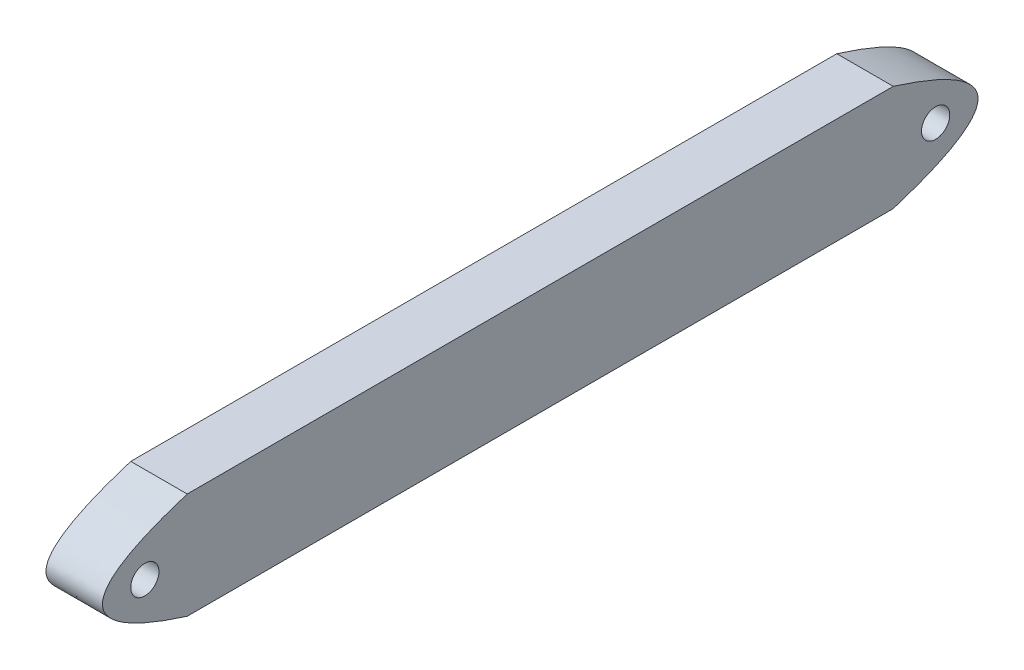
ISO-10303-21;
HEADER;
FILE_DESCRIPTION(('STEP AP214'),'2;1');
FILE_NAME('part.step','',(''),(''),'','','');
FILE_SCHEMA(('AUTOMOTIVE_DESIGN { 1 0 10303 214 1 1 1 1 }'));
ENDSEC;
DATA;
#1=APPLICATION_CONTEXT('core data for automotive mechanical design processes');
#2=APPLICATION_PROTOCOL_DEFINITION('international standard','automotive_design',2000,#1);
#3=PRODUCT_CONTEXT('',#1,'mechanical');
#4=PRODUCT('Part','Part','',(#3));
#5=PRODUCT_RELATED_PRODUCT_CATEGORY('part','',(#4));
#6=PRODUCT_DEFINITION_FORMATION('','',#4);
#7=PRODUCT_DEFINITION_CONTEXT('part definition',#1,'design');
#8=PRODUCT_DEFINITION('design','',#6,#7);
#9=PRODUCT_DEFINITION_SHAPE('','',#8);
#10=(LENGTH_UNIT() NAMED_UNIT(*) SI_UNIT(.MILLI.,.METRE.));
#11=(NAMED_UNIT(*) PLANE_ANGLE_UNIT() SI_UNIT($,.RADIAN.));
#12=(NAMED_UNIT(*) SI_UNIT($,.STERADIAN.) SOLID_ANGLE_UNIT());
#13=UNCERTAINTY_MEASURE_WITH_UNIT(LENGTH_MEASURE(1.E-05),#10,'distance_accuracy_value','');
#14=(GEOMETRIC_REPRESENTATION_CONTEXT(3) GLOBAL_UNCERTAINTY_ASSIGNED_CONTEXT((#13)) GLOBAL_UNIT_ASSIGNED_CONTEXT((#10,
#11,#12)) REPRESENTATION_CONTEXT('',''));
#15=CARTESIAN_POINT('',(0.,0.,0.));
#16=DIRECTION('',(0.,0.,1.));
#17=DIRECTION('',(1.,0.,0.));
#18=AXIS2_PLACEMENT_3D('',#15,#16,#17);
#19=CARTESIAN_POINT('',(8.,-16.0017256081142,-50.1483584502271));
#20=DIRECTION('',(-1.,0.,0.));
#21=DIRECTION('',(0.,0.,1.));
#22=AXIS2_PLACEMENT_3D('',#19,#20,#21);
#23=PLANE('',#22);
#24=CARTESIAN_POINT('',(8.,-8.50172560811416,-62.1483584502271));
#25=CARTESIAN_POINT('',(8.,-16.0017256081142,-38.1483584502271));
#26=CARTESIAN_POINT('',(8.,-23.5017256081142,-62.1483584502271));
#27=B_SPLINE_CURVE_WITH_KNOTS('',2,(#24,#25,#26),.UNSPECIFIED.,.F.,.F.,(3,3),(0.,1.),.UNSPECIFIED.);
#28=CARTESIAN_POINT('',(8.,-8.50172560811416,-62.1483584502271));
#29=VERTEX_POINT('',#28);
#30=CARTESIAN_POINT('',(8.,-23.5017256081142,-62.1483584502271));
#31=VERTEX_POINT('',#30);
#32=EDGE_CURVE('E93',#29,#31,#27,.T.);
#33=ORIENTED_EDGE('',*,*,#32,.T.);
#34=DIRECTION('',(0.,0.,-1.));
#35=VECTOR('',#34,1.);
#36=CARTESIAN_POINT('',(8.,-23.5017256081142,-62.1483584502271));
#37=LINE('',#36,#35);
#38=CARTESIAN_POINT('',(8.,-23.5017256081142,-162.148358450227));
#39=VERTEX_POINT('',#38);
#40=EDGE_CURVE('E88',#31,#39,#37,.T.);
#41=ORIENTED_EDGE('',*,*,#40,.T.);
#42=CARTESIAN_POINT('',(8.,-23.5017256081142,-162.148358450227));
#43=CARTESIAN_POINT('',(8.,-16.0017256081142,-186.148358450227));
#44=CARTESIAN_POINT('',(8.,-8.50172560811416,-162.148358450227));
#45=B_SPLINE_CURVE_WITH_KNOTS('',2,(#42,#43,#44),.UNSPECIFIED.,.F.,.F.,(3,3),(0.,1.),.UNSPECIFIED.);
#46=CARTESIAN_POINT('',(8.,-8.50172560811416,-162.148358450227));
#47=VERTEX_POINT('',#46);
#48=EDGE_CURVE('E91',#39,#47,#45,.T.);
#49=ORIENTED_EDGE('',*,*,#48,.T.);
#50=DIRECTION('',(0.,0.,1.));
#51=VECTOR('',#50,1.);
#52=CARTESIAN_POINT('',(8.,-8.50172560811416,-62.1483584502271));
#53=LINE('',#52,#51);
#54=EDGE_CURVE('E58',#47,#29,#53,.T.);
#55=ORIENTED_EDGE('',*,*,#54,.T.);
#56=EDGE_LOOP('',(#33,#41,#49,#55));
#57=FACE_BOUND('',#56,.T.);
#58=CARTESIAN_POINT('',(8.,-16.0017256081142,-56.148358450227));
#59=DIRECTION('',(1.,0.,0.));
#60=DIRECTION('',(0.,0.,-1.));
#61=AXIS2_PLACEMENT_3D('',#58,#59,#60);
#62=CIRCLE('',#61,2.);
#63=CARTESIAN_POINT('',(8.,-16.0017256081142,-58.148358450227));
#64=VERTEX_POINT('',#63);
#65=EDGE_CURVE('E155',#64,#64,#62,.T.);
#66=ORIENTED_EDGE('',*,*,#65,.F.);
#67=EDGE_LOOP('',(#66));
#68=FACE_BOUND('',#67,.T.);
#69=CARTESIAN_POINT('',(8.,-16.0017256081142,-168.148358450227));
#70=DIRECTION('',(1.,0.,0.));
#71=DIRECTION('',(0.,0.,-1.));
#72=AXIS2_PLACEMENT_3D('',#69,#70,#71);
#73=CIRCLE('',#72,2.);
#74=CARTESIAN_POINT('',(8.,-16.0017256081142,-170.148358450227));
#75=VERTEX_POINT('',#74);
#76=EDGE_CURVE('E144',#75,#75,#73,.T.);
#77=ORIENTED_EDGE('',*,*,#76,.F.);
#78=EDGE_LOOP('',(#77));
#79=FACE_BOUND('',#78,.T.);
#80=ADVANCED_FACE('F39',(#57,#68,#79),#23,.F.);
#81=CARTESIAN_POINT('',(0.,-16.0017256081142,-50.1483584502271));
#82=DIRECTION('',(-1.,0.,0.));
#83=DIRECTION('',(0.,0.,1.));
#84=AXIS2_PLACEMENT_3D('',#81,#82,#83);
#85=PLANE('',#84);
#86=CARTESIAN_POINT('',(0.,-16.0017256081142,-56.148358450227));
#87=DIRECTION('',(1.,0.,0.));
#88=DIRECTION('',(0.,0.,-1.));
#89=AXIS2_PLACEMENT_3D('',#86,#87,#88);
#90=CIRCLE('',#89,2.);
#91=CARTESIAN_POINT('',(0.,-16.0017256081142,-58.148358450227));
#92=VERTEX_POINT('',#91);
#93=EDGE_CURVE('E152',#92,#92,#90,.T.);
#94=ORIENTED_EDGE('',*,*,#93,.T.);
#95=EDGE_LOOP('',(#94));
#96=FACE_BOUND('',#95,.T.);
#97=CARTESIAN_POINT('',(0.,-8.50172560811416,-62.1483584502271));
#98=CARTESIAN_POINT('',(0.,-16.0017256081142,-38.1483584502271));
#99=CARTESIAN_POINT('',(0.,-23.5017256081142,-62.1483584502271));
#100=B_SPLINE_CURVE_WITH_KNOTS('',2,(#97,#98,#99),.UNSPECIFIED.,.F.,.F.,(3,3),(0.,1.),.UNSPECIFIED.);
#101=CARTESIAN_POINT('',(0.,-8.50172560811416,-62.1483584502271));
#102=VERTEX_POINT('',#101);
#103=CARTESIAN_POINT('',(0.,-23.5017256081142,-62.1483584502271));
#104=VERTEX_POINT('',#103);
#105=EDGE_CURVE('E159',#102,#104,#100,.T.);
#106=ORIENTED_EDGE('',*,*,#105,.F.);
#107=DIRECTION('',(0.,0.,1.));
#108=VECTOR('',#107,1.);
#109=CARTESIAN_POINT('',(0.,-8.50172560811416,-62.1483584502271));
#110=LINE('',#109,#108);
#111=CARTESIAN_POINT('',(0.,-8.50172560811416,-162.148358450227));
#112=VERTEX_POINT('',#111);
#113=EDGE_CURVE('E81',#112,#102,#110,.T.);
#114=ORIENTED_EDGE('',*,*,#113,.F.);
#115=CARTESIAN_POINT('',(0.,-23.5017256081142,-162.148358450227));
#116=CARTESIAN_POINT('',(0.,-16.0017256081142,-186.148358450227));
#117=CARTESIAN_POINT('',(0.,-8.50172560811416,-162.148358450227));
#118=B_SPLINE_CURVE_WITH_KNOTS('',2,(#115,#116,#117),.UNSPECIFIED.,.F.,.F.,(3,3),(0.,1.),.UNSPECIFIED.);
#119=CARTESIAN_POINT('',(0.,-23.5017256081142,-162.148358450227));
#120=VERTEX_POINT('',#119);
#121=EDGE_CURVE('E75',#120,#112,#118,.T.);
#122=ORIENTED_EDGE('',*,*,#121,.F.);
#123=DIRECTION('',(0.,0.,-1.));
#124=VECTOR('',#123,1.);
#125=CARTESIAN_POINT('',(0.,-23.5017256081142,-62.1483584502271));
#126=LINE('',#125,#124);
#127=EDGE_CURVE('E98',#104,#120,#126,.T.);
#128=ORIENTED_EDGE('',*,*,#127,.F.);
#129=EDGE_LOOP('',(#106,#114,#122,#128));
#130=FACE_BOUND('',#129,.T.);
#131=CARTESIAN_POINT('',(0.,-16.0017256081142,-168.148358450227));
#132=DIRECTION('',(1.,0.,0.));
#133=DIRECTION('',(0.,0.,-1.));
#134=AXIS2_PLACEMENT_3D('',#131,#132,#133);
#135=CIRCLE('',#134,2.);
#136=CARTESIAN_POINT('',(0.,-16.0017256081142,-170.148358450227));
#137=VERTEX_POINT('',#136);
#138=EDGE_CURVE('E147',#137,#137,#135,.T.);
#139=ORIENTED_EDGE('',*,*,#138,.T.);
#140=EDGE_LOOP('',(#139));
#141=FACE_BOUND('',#140,.T.);
#142=ADVANCED_FACE('F123',(#96,#130,#141),#85,.T.);
#143=DIRECTION('',(-1.,0.,0.));
#144=VECTOR('',#143,1.);
#145=SURFACE_OF_LINEAR_EXTRUSION('',#27,#144);
#146=ORIENTED_EDGE('',*,*,#105,.T.);
#147=DIRECTION('',(-1.,0.,0.));
#148=VECTOR('',#147,1.);
#149=CARTESIAN_POINT('',(8.,-23.5017256081142,-62.1483584502271));
#150=LINE('',#149,#148);
#151=EDGE_CURVE('E11',#31,#104,#150,.T.);
#152=ORIENTED_EDGE('',*,*,#151,.F.);
#153=ORIENTED_EDGE('',*,*,#32,.F.);
#154=DIRECTION('',(-1.,0.,0.));
#155=VECTOR('',#154,1.);
#156=CARTESIAN_POINT('',(8.,-8.50172560811416,-62.1483584502271));
#157=LINE('',#156,#155);
#158=EDGE_CURVE('E105',#29,#102,#157,.T.);
#159=ORIENTED_EDGE('',*,*,#158,.T.);
#160=EDGE_LOOP('',(#146,#152,#153,#159));
#161=FACE_BOUND('',#160,.T.);
#162=ADVANCED_FACE('F41',(#161),#145,.F.);
#163=CARTESIAN_POINT('',(8.,-23.5017256081142,-62.1483584502271));
#164=DIRECTION('',(0.,1.,0.));
#165=DIRECTION('',(0.,0.,1.));
#166=AXIS2_PLACEMENT_3D('',#163,#164,#165);
#167=PLANE('',#166);
#168=ORIENTED_EDGE('',*,*,#127,.T.);
#169=DIRECTION('',(-1.,0.,0.));
#170=VECTOR('',#169,1.);
#171=CARTESIAN_POINT('',(8.,-23.5017256081142,-162.148358450227));
#172=LINE('',#171,#170);
#173=EDGE_CURVE('E50',#39,#120,#172,.T.);
#174=ORIENTED_EDGE('',*,*,#173,.F.);
#175=ORIENTED_EDGE('',*,*,#40,.F.);
#176=ORIENTED_EDGE('',*,*,#151,.T.);
#177=EDGE_LOOP('',(#168,#174,#175,#176));
#178=FACE_BOUND('',#177,.T.);
#179=ADVANCED_FACE('F97',(#178),#167,.F.);
#180=DIRECTION('',(-1.,0.,0.));
#181=VECTOR('',#180,1.);
#182=SURFACE_OF_LINEAR_EXTRUSION('',#45,#181);
#183=ORIENTED_EDGE('',*,*,#121,.T.);
#184=DIRECTION('',(-1.,0.,0.));
#185=VECTOR('',#184,1.);
#186=CARTESIAN_POINT('',(8.,-8.50172560811416,-162.148358450227));
#187=LINE('',#186,#185);
#188=EDGE_CURVE('E100',#47,#112,#187,.T.);
#189=ORIENTED_EDGE('',*,*,#188,.F.);
#190=ORIENTED_EDGE('',*,*,#48,.F.);
#191=ORIENTED_EDGE('',*,*,#173,.T.);
#192=EDGE_LOOP('',(#183,#189,#190,#191));
#193=FACE_BOUND('',#192,.T.);
#194=ADVANCED_FACE('F101',(#193),#182,.F.);
#195=CARTESIAN_POINT('',(8.,-8.50172560811416,-62.1483584502271));
#196=DIRECTION('',(0.,-1.,0.));
#197=DIRECTION('',(0.,0.,-1.));
#198=AXIS2_PLACEMENT_3D('',#195,#196,#197);
#199=PLANE('',#198);
#200=ORIENTED_EDGE('',*,*,#113,.T.);
#201=ORIENTED_EDGE('',*,*,#158,.F.);
#202=ORIENTED_EDGE('',*,*,#54,.F.);
#203=ORIENTED_EDGE('',*,*,#188,.T.);
#204=EDGE_LOOP('',(#200,#201,#202,#203));
#205=FACE_BOUND('',#204,.T.);
#206=ADVANCED_FACE('F117',(#205),#199,.F.);
#207=CARTESIAN_POINT('',(8.,-16.0017256081142,-56.148358450227));
#208=DIRECTION('',(-1.,0.,0.));
#209=DIRECTION('',(0.,0.,1.));
#210=AXIS2_PLACEMENT_3D('',#207,#208,#209);
#211=CYLINDRICAL_SURFACE('',#210,2.);
#212=ORIENTED_EDGE('',*,*,#65,.T.);
#213=EDGE_LOOP('',(#212));
#214=FACE_BOUND('',#213,.T.);
#215=ORIENTED_EDGE('',*,*,#93,.F.);
#216=EDGE_LOOP('',(#215));
#217=FACE_BOUND('',#216,.T.);
#218=ADVANCED_FACE('F132',(#214,#217),#211,.F.);
#219=CARTESIAN_POINT('',(8.,-16.0017256081142,-168.148358450227));
#220=DIRECTION('',(-1.,0.,0.));
#221=DIRECTION('',(0.,0.,1.));
#222=AXIS2_PLACEMENT_3D('',#219,#220,#221);
#223=CYLINDRICAL_SURFACE('',#222,2.);
#224=ORIENTED_EDGE('',*,*,#76,.T.);
#225=EDGE_LOOP('',(#224));
#226=FACE_BOUND('',#225,.T.);
#227=ORIENTED_EDGE('',*,*,#138,.F.);
#228=EDGE_LOOP('',(#227));
#229=FACE_BOUND('',#228,.T.);
#230=ADVANCED_FACE('F135',(#226,#229),#223,.F.);
#231=CLOSED_SHELL('',(#80,#142,#162,#179,#194,#206,#218,#230));
#232=MANIFOLD_SOLID_BREP('B2',#231);
#233=ADVANCED_BREP_SHAPE_REPRESENTATION('',(#18,#232),#14);
#234=SHAPE_DEFINITION_REPRESENTATION(#9,#233);
ENDSEC;
END-ISO-10303-21;
